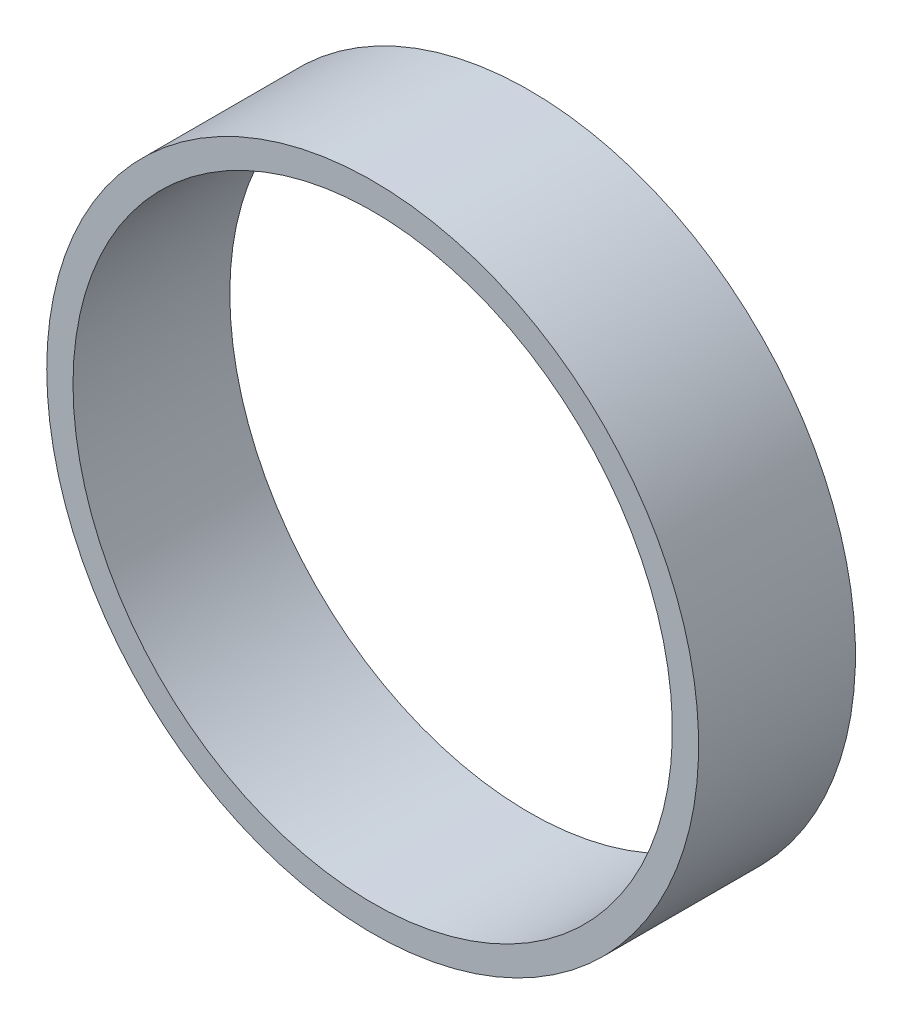
ISO-10303-21;
HEADER;
FILE_DESCRIPTION(('STEP AP214'),'2;1');
FILE_NAME('part.step','',(''),(''),'','','');
FILE_SCHEMA(('AUTOMOTIVE_DESIGN { 1 0 10303 214 1 1 1 1 }'));
ENDSEC;
DATA;
#1=APPLICATION_CONTEXT('core data for automotive mechanical design processes');
#2=APPLICATION_PROTOCOL_DEFINITION('international standard','automotive_design',2000,#1);
#3=PRODUCT_CONTEXT('',#1,'mechanical');
#4=PRODUCT('Part','Part','',(#3));
#5=PRODUCT_RELATED_PRODUCT_CATEGORY('part','',(#4));
#6=PRODUCT_DEFINITION_FORMATION('','',#4);
#7=PRODUCT_DEFINITION_CONTEXT('part definition',#1,'design');
#8=PRODUCT_DEFINITION('design','',#6,#7);
#9=PRODUCT_DEFINITION_SHAPE('','',#8);
#10=(LENGTH_UNIT() NAMED_UNIT(*) SI_UNIT(.MILLI.,.METRE.));
#11=(NAMED_UNIT(*) PLANE_ANGLE_UNIT() SI_UNIT($,.RADIAN.));
#12=(NAMED_UNIT(*) SI_UNIT($,.STERADIAN.) SOLID_ANGLE_UNIT());
#13=UNCERTAINTY_MEASURE_WITH_UNIT(LENGTH_MEASURE(1.E-05),#10,'distance_accuracy_value','');
#14=(GEOMETRIC_REPRESENTATION_CONTEXT(3) GLOBAL_UNCERTAINTY_ASSIGNED_CONTEXT((#13)) GLOBAL_UNIT_ASSIGNED_CONTEXT((#10,
#11,#12)) REPRESENTATION_CONTEXT('',''));
#15=CARTESIAN_POINT('',(0.,0.,0.));
#16=DIRECTION('',(0.,0.,1.));
#17=DIRECTION('',(1.,0.,0.));
#18=AXIS2_PLACEMENT_3D('',#15,#16,#17);
#19=CARTESIAN_POINT('',(-10.19999996006,-1.579891003587,-99.8));
#20=DIRECTION('',(0.,0.,-1.));
#21=DIRECTION('',(-1.,0.,0.));
#22=AXIS2_PLACEMENT_3D('',#19,#20,#21);
#23=CYLINDRICAL_SURFACE('',#22,34.39984500491);
#24=CARTESIAN_POINT('',(-10.19999996006,-1.579891003587,-81.8));
#25=DIRECTION('',(0.,0.,-1.));
#26=DIRECTION('',(-1.,0.,0.));
#27=AXIS2_PLACEMENT_3D('',#24,#25,#26);
#28=CIRCLE('',#27,34.39984500491);
#29=CARTESIAN_POINT('',(-44.59984496497,-1.579891003587,-81.8));
#30=VERTEX_POINT('',#29);
#31=EDGE_CURVE('E18',#30,#30,#28,.F.);
#32=ORIENTED_EDGE('',*,*,#31,.T.);
#33=EDGE_LOOP('',(#32));
#34=FACE_BOUND('',#33,.T.);
#35=CARTESIAN_POINT('',(-10.19999996006,-1.579891003587,-99.8));
#36=DIRECTION('',(0.,0.,-1.));
#37=DIRECTION('',(-1.,0.,0.));
#38=AXIS2_PLACEMENT_3D('',#35,#36,#37);
#39=CIRCLE('',#38,34.39984500491);
#40=CARTESIAN_POINT('',(-44.59984496497,-1.579891003587,-99.8));
#41=VERTEX_POINT('',#40);
#42=EDGE_CURVE('E27',#41,#41,#39,.F.);
#43=ORIENTED_EDGE('',*,*,#42,.F.);
#44=EDGE_LOOP('',(#43));
#45=FACE_BOUND('',#44,.T.);
#46=ADVANCED_FACE('F15',(#34,#45),#23,.F.);
#47=CARTESIAN_POINT('',(-10.19999999997,-4.58,-81.8));
#48=DIRECTION('',(0.,0.,-1.));
#49=DIRECTION('',(-1.,0.,0.));
#50=AXIS2_PLACEMENT_3D('',#47,#48,#49);
#51=PLANE('',#50);
#52=ORIENTED_EDGE('',*,*,#31,.F.);
#53=EDGE_LOOP('',(#52));
#54=FACE_BOUND('',#53,.T.);
#55=CARTESIAN_POINT('',(-10.19999996006,-1.579891003587,-81.8));
#56=DIRECTION('',(0.,0.,-1.));
#57=DIRECTION('',(-1.,0.,0.));
#58=AXIS2_PLACEMENT_3D('',#55,#56,#57);
#59=CIRCLE('',#58,37.41501356398);
#60=CARTESIAN_POINT('',(-47.61501352404,-1.579891003587,-81.8));
#61=VERTEX_POINT('',#60);
#62=EDGE_CURVE('E22',#61,#61,#59,.T.);
#63=ORIENTED_EDGE('',*,*,#62,.F.);
#64=EDGE_LOOP('',(#63));
#65=FACE_BOUND('',#64,.T.);
#66=ADVANCED_FACE('F37',(#54,#65),#51,.F.);
#67=CARTESIAN_POINT('',(-10.19999999997,-4.58,-99.8));
#68=DIRECTION('',(0.,0.,-1.));
#69=DIRECTION('',(-1.,0.,0.));
#70=AXIS2_PLACEMENT_3D('',#67,#68,#69);
#71=PLANE('',#70);
#72=ORIENTED_EDGE('',*,*,#42,.T.);
#73=EDGE_LOOP('',(#72));
#74=FACE_BOUND('',#73,.T.);
#75=CARTESIAN_POINT('',(-10.19999996006,-1.579891003587,-99.8));
#76=DIRECTION('',(0.,0.,-1.));
#77=DIRECTION('',(-1.,0.,0.));
#78=AXIS2_PLACEMENT_3D('',#75,#76,#77);
#79=CIRCLE('',#78,37.41501356398);
#80=CARTESIAN_POINT('',(-47.61501352404,-1.579891003587,-99.8));
#81=VERTEX_POINT('',#80);
#82=EDGE_CURVE('E10',#81,#81,#79,.F.);
#83=ORIENTED_EDGE('',*,*,#82,.F.);
#84=EDGE_LOOP('',(#83));
#85=FACE_BOUND('',#84,.T.);
#86=ADVANCED_FACE('F40',(#74,#85),#71,.T.);
#87=CARTESIAN_POINT('',(-10.19999996006,-1.579891003587,-99.8));
#88=DIRECTION('',(0.,0.,-1.));
#89=DIRECTION('',(-1.,0.,0.));
#90=AXIS2_PLACEMENT_3D('',#87,#88,#89);
#91=CYLINDRICAL_SURFACE('',#90,37.41501356398);
#92=ORIENTED_EDGE('',*,*,#62,.T.);
#93=EDGE_LOOP('',(#92));
#94=FACE_BOUND('',#93,.T.);
#95=ORIENTED_EDGE('',*,*,#82,.T.);
#96=EDGE_LOOP('',(#95));
#97=FACE_BOUND('',#96,.T.);
#98=ADVANCED_FACE('F43',(#94,#97),#91,.T.);
#99=CLOSED_SHELL('',(#46,#66,#86,#98));
#100=MANIFOLD_SOLID_BREP('B1',#99);
#101=ADVANCED_BREP_SHAPE_REPRESENTATION('',(#18,#100),#14);
#102=SHAPE_DEFINITION_REPRESENTATION(#9,#101);
ENDSEC;
END-ISO-10303-21;
